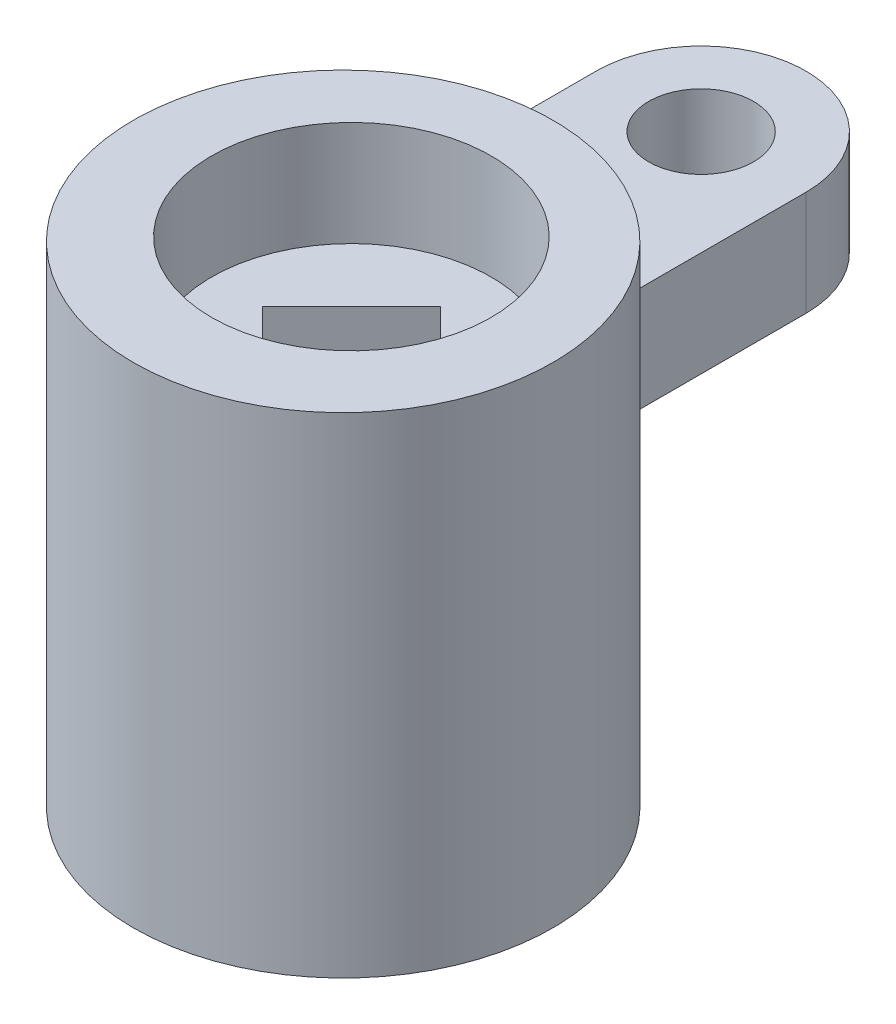
ISO-10303-21;
HEADER;
FILE_DESCRIPTION(('STEP AP214'),'2;1');
FILE_NAME('part.step','',(''),(''),'','','');
FILE_SCHEMA(('AUTOMOTIVE_DESIGN { 1 0 10303 214 1 1 1 1 }'));
ENDSEC;
DATA;
#1=APPLICATION_CONTEXT('core data for automotive mechanical design processes');
#2=APPLICATION_PROTOCOL_DEFINITION('international standard','automotive_design',2000,#1);
#3=PRODUCT_CONTEXT('',#1,'mechanical');
#4=PRODUCT('Part','Part','',(#3));
#5=PRODUCT_RELATED_PRODUCT_CATEGORY('part','',(#4));
#6=PRODUCT_DEFINITION_FORMATION('','',#4);
#7=PRODUCT_DEFINITION_CONTEXT('part definition',#1,'design');
#8=PRODUCT_DEFINITION('design','',#6,#7);
#9=PRODUCT_DEFINITION_SHAPE('','',#8);
#10=(LENGTH_UNIT() NAMED_UNIT(*) SI_UNIT(.MILLI.,.METRE.));
#11=(NAMED_UNIT(*) PLANE_ANGLE_UNIT() SI_UNIT($,.RADIAN.));
#12=(NAMED_UNIT(*) SI_UNIT($,.STERADIAN.) SOLID_ANGLE_UNIT());
#13=UNCERTAINTY_MEASURE_WITH_UNIT(LENGTH_MEASURE(1.E-05),#10,'distance_accuracy_value','');
#14=(GEOMETRIC_REPRESENTATION_CONTEXT(3) GLOBAL_UNCERTAINTY_ASSIGNED_CONTEXT((#13)) GLOBAL_UNIT_ASSIGNED_CONTEXT((#10,
#11,#12)) REPRESENTATION_CONTEXT('',''));
#15=CARTESIAN_POINT('',(0.,0.,0.));
#16=DIRECTION('',(0.,0.,1.));
#17=DIRECTION('',(1.,0.,0.));
#18=AXIS2_PLACEMENT_3D('',#15,#16,#17);
#19=CARTESIAN_POINT('',(0.,0.,1.17345771558665));
#20=DIRECTION('',(0.,1.,0.));
#21=DIRECTION('',(0.,0.,1.));
#22=AXIS2_PLACEMENT_3D('',#19,#20,#21);
#23=PLANE('',#22);
#24=CARTESIAN_POINT('',(0.,0.,1.17345771558665));
#25=DIRECTION('',(0.,1.,0.));
#26=DIRECTION('',(0.,0.,1.));
#27=AXIS2_PLACEMENT_3D('',#24,#25,#26);
#28=CIRCLE('',#27,30.);
#29=CARTESIAN_POINT('',(0.,0.,31.1734577155866));
#30=VERTEX_POINT('',#29);
#31=EDGE_CURVE('E45',#30,#30,#28,.T.);
#32=ORIENTED_EDGE('',*,*,#31,.F.);
#33=EDGE_LOOP('',(#32));
#34=FACE_BOUND('',#33,.T.);
#35=DIRECTION('',(0.707106781186553,0.,0.707106781186542));
#36=VECTOR('',#35,1.);
#37=CARTESIAN_POINT('',(-12.7279220613579,0.,0.));
#38=LINE('',#37,#36);
#39=CARTESIAN_POINT('',(-12.7279220613579,0.,0.));
#40=VERTEX_POINT('',#39);
#41=CARTESIAN_POINT('',(0.,0.,12.7279220613578));
#42=VERTEX_POINT('',#41);
#43=EDGE_CURVE('E140',#40,#42,#38,.T.);
#44=ORIENTED_EDGE('',*,*,#43,.T.);
#45=DIRECTION('',(0.707106781186551,0.,-0.707106781186544));
#46=VECTOR('',#45,1.);
#47=CARTESIAN_POINT('',(0.,0.,12.7279220613578));
#48=LINE('',#47,#46);
#49=CARTESIAN_POINT('',(12.7279220613579,0.,0.));
#50=VERTEX_POINT('',#49);
#51=EDGE_CURVE('E157',#42,#50,#48,.T.);
#52=ORIENTED_EDGE('',*,*,#51,.T.);
#53=DIRECTION('',(-0.707106781186544,0.,-0.707106781186551));
#54=VECTOR('',#53,1.);
#55=CARTESIAN_POINT('',(12.7279220613579,0.,0.));
#56=LINE('',#55,#54);
#57=CARTESIAN_POINT('',(1.39747780576547E-13,0.,-12.7279220613579));
#58=VERTEX_POINT('',#57);
#59=EDGE_CURVE('E160',#50,#58,#56,.T.);
#60=ORIENTED_EDGE('',*,*,#59,.T.);
#61=DIRECTION('',(-0.707106781186549,0.,0.707106781186546));
#62=VECTOR('',#61,1.);
#63=CARTESIAN_POINT('',(1.39747780576547E-13,0.,-12.7279220613579));
#64=LINE('',#63,#62);
#65=EDGE_CURVE('E147',#58,#40,#64,.T.);
#66=ORIENTED_EDGE('',*,*,#65,.T.);
#67=EDGE_LOOP('',(#44,#52,#60,#66));
#68=FACE_BOUND('',#67,.T.);
#69=ADVANCED_FACE('F41',(#34,#68),#23,.F.);
#70=CARTESIAN_POINT('',(0.,70.,1.17345771558665));
#71=DIRECTION('',(0.,-1.,0.));
#72=DIRECTION('',(0.,0.,-1.));
#73=AXIS2_PLACEMENT_3D('',#70,#71,#72);
#74=CYLINDRICAL_SURFACE('',#73,30.);
#75=DIRECTION('',(0.,-1.,0.));
#76=VECTOR('',#75,1.);
#77=CARTESIAN_POINT('',(15.,58.,-24.8073043979465));
#78=LINE('',#77,#76);
#79=CARTESIAN_POINT('',(15.,58.,-24.8073043979465));
#80=VERTEX_POINT('',#79);
#81=CARTESIAN_POINT('',(15.,43.,-24.8073043979465));
#82=VERTEX_POINT('',#81);
#83=EDGE_CURVE('E56',#80,#82,#78,.T.);
#84=ORIENTED_EDGE('',*,*,#83,.F.);
#85=CARTESIAN_POINT('',(0.,58.,1.17345771558665));
#86=DIRECTION('',(0.,1.,0.));
#87=DIRECTION('',(0.,0.,1.));
#88=AXIS2_PLACEMENT_3D('',#85,#86,#87);
#89=CIRCLE('',#88,30.);
#90=CARTESIAN_POINT('',(-15.,58.,-24.8073043979465));
#91=VERTEX_POINT('',#90);
#92=EDGE_CURVE('E60',#80,#91,#89,.T.);
#93=ORIENTED_EDGE('',*,*,#92,.T.);
#94=DIRECTION('',(0.,-1.,0.));
#95=VECTOR('',#94,1.);
#96=CARTESIAN_POINT('',(-15.,58.,-24.8073043979465));
#97=LINE('',#96,#95);
#98=CARTESIAN_POINT('',(-15.,43.,-24.8073043979465));
#99=VERTEX_POINT('',#98);
#100=EDGE_CURVE('E123',#91,#99,#97,.T.);
#101=ORIENTED_EDGE('',*,*,#100,.T.);
#102=CARTESIAN_POINT('',(0.,43.,1.17345771558665));
#103=DIRECTION('',(0.,1.,0.));
#104=DIRECTION('',(0.,0.,1.));
#105=AXIS2_PLACEMENT_3D('',#102,#103,#104);
#106=CIRCLE('',#105,30.);
#107=EDGE_CURVE('E133',#82,#99,#106,.T.);
#108=ORIENTED_EDGE('',*,*,#107,.F.);
#109=EDGE_LOOP('',(#84,#93,#101,#108));
#110=FACE_BOUND('',#109,.T.);
#111=CARTESIAN_POINT('',(0.,70.,1.17345771558665));
#112=DIRECTION('',(0.,1.,0.));
#113=DIRECTION('',(0.,0.,1.));
#114=AXIS2_PLACEMENT_3D('',#111,#112,#113);
#115=CIRCLE('',#114,30.);
#116=CARTESIAN_POINT('',(0.,70.,31.1734577155866));
#117=VERTEX_POINT('',#116);
#118=EDGE_CURVE('E11',#117,#117,#115,.T.);
#119=ORIENTED_EDGE('',*,*,#118,.F.);
#120=EDGE_LOOP('',(#119));
#121=FACE_BOUND('',#120,.T.);
#122=ORIENTED_EDGE('',*,*,#31,.T.);
#123=EDGE_LOOP('',(#122));
#124=FACE_BOUND('',#123,.T.);
#125=ADVANCED_FACE('F43',(#110,#121,#124),#74,.T.);
#126=CARTESIAN_POINT('',(0.,70.,1.17345771558665));
#127=DIRECTION('',(0.,1.,0.));
#128=DIRECTION('',(0.,0.,1.));
#129=AXIS2_PLACEMENT_3D('',#126,#127,#128);
#130=PLANE('',#129);
#131=CARTESIAN_POINT('',(0.,70.,0.));
#132=DIRECTION('',(0.,1.,0.));
#133=DIRECTION('',(0.,0.,1.));
#134=AXIS2_PLACEMENT_3D('',#131,#132,#133);
#135=CIRCLE('',#134,20.);
#136=CARTESIAN_POINT('',(0.,70.,20.));
#137=VERTEX_POINT('',#136);
#138=EDGE_CURVE('E174',#137,#137,#135,.T.);
#139=ORIENTED_EDGE('',*,*,#138,.F.);
#140=EDGE_LOOP('',(#139));
#141=FACE_BOUND('',#140,.T.);
#142=ORIENTED_EDGE('',*,*,#118,.T.);
#143=EDGE_LOOP('',(#142));
#144=FACE_BOUND('',#143,.T.);
#145=ADVANCED_FACE('F183',(#141,#144),#130,.T.);
#146=CARTESIAN_POINT('',(0.,55.,0.));
#147=DIRECTION('',(0.,1.,0.));
#148=DIRECTION('',(0.,0.,1.));
#149=AXIS2_PLACEMENT_3D('',#146,#147,#148);
#150=CYLINDRICAL_SURFACE('',#149,20.);
#151=CARTESIAN_POINT('',(0.,55.,0.));
#152=DIRECTION('',(0.,1.,0.));
#153=DIRECTION('',(0.,0.,1.));
#154=AXIS2_PLACEMENT_3D('',#151,#152,#153);
#155=CIRCLE('',#154,20.);
#156=CARTESIAN_POINT('',(0.,55.,20.));
#157=VERTEX_POINT('',#156);
#158=EDGE_CURVE('E175',#157,#157,#155,.T.);
#159=ORIENTED_EDGE('',*,*,#158,.F.);
#160=EDGE_LOOP('',(#159));
#161=FACE_BOUND('',#160,.T.);
#162=ORIENTED_EDGE('',*,*,#138,.T.);
#163=EDGE_LOOP('',(#162));
#164=FACE_BOUND('',#163,.T.);
#165=ADVANCED_FACE('F181',(#161,#164),#150,.F.);
#166=CARTESIAN_POINT('',(0.,55.,0.));
#167=DIRECTION('',(0.,1.,0.));
#168=DIRECTION('',(0.,0.,1.));
#169=AXIS2_PLACEMENT_3D('',#166,#167,#168);
#170=PLANE('',#169);
#171=DIRECTION('',(0.707106781186553,0.,0.707106781186542));
#172=VECTOR('',#171,1.);
#173=CARTESIAN_POINT('',(-12.7279220613579,55.,0.));
#174=LINE('',#173,#172);
#175=CARTESIAN_POINT('',(-12.7279220613579,55.,0.));
#176=VERTEX_POINT('',#175);
#177=CARTESIAN_POINT('',(0.,55.,12.7279220613578));
#178=VERTEX_POINT('',#177);
#179=EDGE_CURVE('E144',#176,#178,#174,.T.);
#180=ORIENTED_EDGE('',*,*,#179,.F.);
#181=DIRECTION('',(-0.707106781186549,0.,0.707106781186546));
#182=VECTOR('',#181,1.);
#183=CARTESIAN_POINT('',(1.39747780576547E-13,55.,-12.7279220613579));
#184=LINE('',#183,#182);
#185=CARTESIAN_POINT('',(1.39747780576547E-13,55.,-12.7279220613579));
#186=VERTEX_POINT('',#185);
#187=EDGE_CURVE('E152',#186,#176,#184,.T.);
#188=ORIENTED_EDGE('',*,*,#187,.F.);
#189=DIRECTION('',(-0.707106781186544,0.,-0.707106781186551));
#190=VECTOR('',#189,1.);
#191=CARTESIAN_POINT('',(12.7279220613579,55.,0.));
#192=LINE('',#191,#190);
#193=CARTESIAN_POINT('',(12.7279220613579,55.,0.));
#194=VERTEX_POINT('',#193);
#195=EDGE_CURVE('E149',#194,#186,#192,.T.);
#196=ORIENTED_EDGE('',*,*,#195,.F.);
#197=DIRECTION('',(0.707106781186551,0.,-0.707106781186544));
#198=VECTOR('',#197,1.);
#199=CARTESIAN_POINT('',(0.,55.,12.7279220613578));
#200=LINE('',#199,#198);
#201=EDGE_CURVE('E146',#178,#194,#200,.T.);
#202=ORIENTED_EDGE('',*,*,#201,.F.);
#203=EDGE_LOOP('',(#180,#188,#196,#202));
#204=FACE_BOUND('',#203,.T.);
#205=ORIENTED_EDGE('',*,*,#158,.T.);
#206=EDGE_LOOP('',(#205));
#207=FACE_BOUND('',#206,.T.);
#208=ADVANCED_FACE('F207',(#204,#207),#170,.T.);
#209=CARTESIAN_POINT('',(-12.7279220613579,55.,0.));
#210=DIRECTION('',(0.707106781186542,0.,-0.707106781186554));
#211=DIRECTION('',(-0.707106781186554,0.,-0.707106781186542));
#212=AXIS2_PLACEMENT_3D('',#209,#210,#211);
#213=PLANE('',#212);
#214=ORIENTED_EDGE('',*,*,#43,.F.);
#215=DIRECTION('',(0.,-1.,0.));
#216=VECTOR('',#215,1.);
#217=CARTESIAN_POINT('',(-12.7279220613579,55.,0.));
#218=LINE('',#217,#216);
#219=EDGE_CURVE('E154',#176,#40,#218,.T.);
#220=ORIENTED_EDGE('',*,*,#219,.F.);
#221=ORIENTED_EDGE('',*,*,#179,.T.);
#222=DIRECTION('',(0.,-1.,0.));
#223=VECTOR('',#222,1.);
#224=CARTESIAN_POINT('',(0.,55.,12.7279220613578));
#225=LINE('',#224,#223);
#226=EDGE_CURVE('E171',#178,#42,#225,.T.);
#227=ORIENTED_EDGE('',*,*,#226,.T.);
#228=EDGE_LOOP('',(#214,#220,#221,#227));
#229=FACE_BOUND('',#228,.T.);
#230=ADVANCED_FACE('F199',(#229),#213,.T.);
#231=CARTESIAN_POINT('',(0.,55.,12.7279220613578));
#232=DIRECTION('',(-0.707106781186544,0.,-0.707106781186552));
#233=DIRECTION('',(-0.707106781186551,0.,0.707106781186544));
#234=AXIS2_PLACEMENT_3D('',#231,#232,#233);
#235=PLANE('',#234);
#236=ORIENTED_EDGE('',*,*,#51,.F.);
#237=ORIENTED_EDGE('',*,*,#226,.F.);
#238=ORIENTED_EDGE('',*,*,#201,.T.);
#239=DIRECTION('',(0.,-1.,0.));
#240=VECTOR('',#239,1.);
#241=CARTESIAN_POINT('',(12.7279220613579,55.,0.));
#242=LINE('',#241,#240);
#243=EDGE_CURVE('E169',#194,#50,#242,.T.);
#244=ORIENTED_EDGE('',*,*,#243,.T.);
#245=EDGE_LOOP('',(#236,#237,#238,#244));
#246=FACE_BOUND('',#245,.T.);
#247=ADVANCED_FACE('F211',(#246),#235,.T.);
#248=CARTESIAN_POINT('',(12.7279220613579,55.,0.));
#249=DIRECTION('',(-0.707106781186552,0.,0.707106781186544));
#250=DIRECTION('',(0.707106781186544,0.,0.707106781186551));
#251=AXIS2_PLACEMENT_3D('',#248,#249,#250);
#252=PLANE('',#251);
#253=ORIENTED_EDGE('',*,*,#59,.F.);
#254=ORIENTED_EDGE('',*,*,#243,.F.);
#255=ORIENTED_EDGE('',*,*,#195,.T.);
#256=DIRECTION('',(0.,-1.,0.));
#257=VECTOR('',#256,1.);
#258=CARTESIAN_POINT('',(1.39747780576547E-13,55.,-12.7279220613579));
#259=LINE('',#258,#257);
#260=EDGE_CURVE('E167',#186,#58,#259,.T.);
#261=ORIENTED_EDGE('',*,*,#260,.T.);
#262=EDGE_LOOP('',(#253,#254,#255,#261));
#263=FACE_BOUND('',#262,.T.);
#264=ADVANCED_FACE('F215',(#263),#252,.T.);
#265=CARTESIAN_POINT('',(1.39747780576547E-13,55.,-12.7279220613579));
#266=DIRECTION('',(0.707106781186546,0.,0.707106781186549));
#267=DIRECTION('',(0.707106781186549,0.,-0.707106781186546));
#268=AXIS2_PLACEMENT_3D('',#265,#266,#267);
#269=PLANE('',#268);
#270=ORIENTED_EDGE('',*,*,#65,.F.);
#271=ORIENTED_EDGE('',*,*,#260,.F.);
#272=ORIENTED_EDGE('',*,*,#187,.T.);
#273=ORIENTED_EDGE('',*,*,#219,.T.);
#274=EDGE_LOOP('',(#270,#271,#272,#273));
#275=FACE_BOUND('',#274,.T.);
#276=ADVANCED_FACE('F203',(#275),#269,.T.);
#277=CARTESIAN_POINT('',(15.,58.,-50.));
#278=DIRECTION('',(1.,0.,0.));
#279=DIRECTION('',(0.,0.,-1.));
#280=AXIS2_PLACEMENT_3D('',#277,#278,#279);
#281=PLANE('',#280);
#282=DIRECTION('',(0.,0.,1.));
#283=VECTOR('',#282,1.);
#284=CARTESIAN_POINT('',(15.,43.,-50.));
#285=LINE('',#284,#283);
#286=CARTESIAN_POINT('',(15.,43.,-50.));
#287=VERTEX_POINT('',#286);
#288=EDGE_CURVE('E130',#287,#82,#285,.T.);
#289=ORIENTED_EDGE('',*,*,#288,.F.);
#290=DIRECTION('',(0.,-1.,0.));
#291=VECTOR('',#290,1.);
#292=CARTESIAN_POINT('',(15.,58.,-50.));
#293=LINE('',#292,#291);
#294=CARTESIAN_POINT('',(15.,58.,-50.));
#295=VERTEX_POINT('',#294);
#296=EDGE_CURVE('E122',#295,#287,#293,.T.);
#297=ORIENTED_EDGE('',*,*,#296,.F.);
#298=DIRECTION('',(0.,0.,1.));
#299=VECTOR('',#298,1.);
#300=CARTESIAN_POINT('',(15.,58.,-50.));
#301=LINE('',#300,#299);
#302=EDGE_CURVE('E111',#295,#80,#301,.T.);
#303=ORIENTED_EDGE('',*,*,#302,.T.);
#304=ORIENTED_EDGE('',*,*,#83,.T.);
#305=EDGE_LOOP('',(#289,#297,#303,#304));
#306=FACE_BOUND('',#305,.T.);
#307=ADVANCED_FACE('F222',(#306),#281,.T.);
#308=CARTESIAN_POINT('',(0.,58.,-50.));
#309=DIRECTION('',(0.,-1.,0.));
#310=DIRECTION('',(0.,0.,-1.));
#311=AXIS2_PLACEMENT_3D('',#308,#309,#310);
#312=CYLINDRICAL_SURFACE('',#311,15.);
#313=CARTESIAN_POINT('',(0.,43.,-50.));
#314=DIRECTION('',(0.,1.,0.));
#315=DIRECTION('',(0.,0.,1.));
#316=AXIS2_PLACEMENT_3D('',#313,#314,#315);
#317=CIRCLE('',#316,15.);
#318=CARTESIAN_POINT('',(-15.,43.,-50.));
#319=VERTEX_POINT('',#318);
#320=EDGE_CURVE('E118',#287,#319,#317,.T.);
#321=ORIENTED_EDGE('',*,*,#320,.T.);
#322=DIRECTION('',(0.,-1.,0.));
#323=VECTOR('',#322,1.);
#324=CARTESIAN_POINT('',(-15.,58.,-50.));
#325=LINE('',#324,#323);
#326=CARTESIAN_POINT('',(-15.,58.,-50.));
#327=VERTEX_POINT('',#326);
#328=EDGE_CURVE('E115',#327,#319,#325,.T.);
#329=ORIENTED_EDGE('',*,*,#328,.F.);
#330=CARTESIAN_POINT('',(0.,58.,-50.));
#331=DIRECTION('',(0.,1.,0.));
#332=DIRECTION('',(0.,0.,1.));
#333=AXIS2_PLACEMENT_3D('',#330,#331,#332);
#334=CIRCLE('',#333,15.);
#335=EDGE_CURVE('E104',#295,#327,#334,.T.);
#336=ORIENTED_EDGE('',*,*,#335,.F.);
#337=ORIENTED_EDGE('',*,*,#296,.T.);
#338=EDGE_LOOP('',(#321,#329,#336,#337));
#339=FACE_BOUND('',#338,.T.);
#340=ADVANCED_FACE('F116',(#339),#312,.T.);
#341=CARTESIAN_POINT('',(-15.,58.,-50.));
#342=DIRECTION('',(1.,0.,0.));
#343=DIRECTION('',(0.,0.,-1.));
#344=AXIS2_PLACEMENT_3D('',#341,#342,#343);
#345=PLANE('',#344);
#346=DIRECTION('',(0.,0.,1.));
#347=VECTOR('',#346,1.);
#348=CARTESIAN_POINT('',(-15.,43.,-50.));
#349=LINE('',#348,#347);
#350=EDGE_CURVE('E137',#319,#99,#349,.T.);
#351=ORIENTED_EDGE('',*,*,#350,.T.);
#352=ORIENTED_EDGE('',*,*,#100,.F.);
#353=DIRECTION('',(0.,0.,1.));
#354=VECTOR('',#353,1.);
#355=CARTESIAN_POINT('',(-15.,58.,-50.));
#356=LINE('',#355,#354);
#357=EDGE_CURVE('E108',#327,#91,#356,.T.);
#358=ORIENTED_EDGE('',*,*,#357,.F.);
#359=ORIENTED_EDGE('',*,*,#328,.T.);
#360=EDGE_LOOP('',(#351,#352,#358,#359));
#361=FACE_BOUND('',#360,.T.);
#362=ADVANCED_FACE('F125',(#361),#345,.F.);
#363=CARTESIAN_POINT('',(0.,58.,1.17345771558665));
#364=DIRECTION('',(0.,1.,0.));
#365=DIRECTION('',(0.,0.,1.));
#366=AXIS2_PLACEMENT_3D('',#363,#364,#365);
#367=PLANE('',#366);
#368=CARTESIAN_POINT('',(0.,58.,-50.));
#369=DIRECTION('',(0.,1.,0.));
#370=DIRECTION('',(0.,0.,1.));
#371=AXIS2_PLACEMENT_3D('',#368,#369,#370);
#372=CIRCLE('',#371,7.5);
#373=CARTESIAN_POINT('',(0.,58.,-42.5));
#374=VERTEX_POINT('',#373);
#375=EDGE_CURVE('E329',#374,#374,#372,.T.);
#376=ORIENTED_EDGE('',*,*,#375,.F.);
#377=EDGE_LOOP('',(#376));
#378=FACE_BOUND('',#377,.T.);
#379=ORIENTED_EDGE('',*,*,#302,.F.);
#380=ORIENTED_EDGE('',*,*,#335,.T.);
#381=ORIENTED_EDGE('',*,*,#357,.T.);
#382=ORIENTED_EDGE('',*,*,#92,.F.);
#383=EDGE_LOOP('',(#379,#380,#381,#382));
#384=FACE_BOUND('',#383,.T.);
#385=ADVANCED_FACE('F106',(#378,#384),#367,.T.);
#386=CARTESIAN_POINT('',(0.,43.,1.17345771558665));
#387=DIRECTION('',(0.,1.,0.));
#388=DIRECTION('',(0.,0.,1.));
#389=AXIS2_PLACEMENT_3D('',#386,#387,#388);
#390=PLANE('',#389);
#391=CARTESIAN_POINT('',(0.,43.,-50.));
#392=DIRECTION('',(0.,1.,0.));
#393=DIRECTION('',(0.,0.,1.));
#394=AXIS2_PLACEMENT_3D('',#391,#392,#393);
#395=CIRCLE('',#394,7.5);
#396=CARTESIAN_POINT('',(0.,43.,-42.5));
#397=VERTEX_POINT('',#396);
#398=EDGE_CURVE('E134',#397,#397,#395,.T.);
#399=ORIENTED_EDGE('',*,*,#398,.T.);
#400=EDGE_LOOP('',(#399));
#401=FACE_BOUND('',#400,.T.);
#402=ORIENTED_EDGE('',*,*,#288,.T.);
#403=ORIENTED_EDGE('',*,*,#107,.T.);
#404=ORIENTED_EDGE('',*,*,#350,.F.);
#405=ORIENTED_EDGE('',*,*,#320,.F.);
#406=EDGE_LOOP('',(#402,#403,#404,#405));
#407=FACE_BOUND('',#406,.T.);
#408=ADVANCED_FACE('F301',(#401,#407),#390,.F.);
#409=CARTESIAN_POINT('',(0.,43.,-50.));
#410=DIRECTION('',(0.,1.,0.));
#411=DIRECTION('',(0.,0.,1.));
#412=AXIS2_PLACEMENT_3D('',#409,#410,#411);
#413=CYLINDRICAL_SURFACE('',#412,7.5);
#414=ORIENTED_EDGE('',*,*,#398,.F.);
#415=EDGE_LOOP('',(#414));
#416=FACE_BOUND('',#415,.T.);
#417=ORIENTED_EDGE('',*,*,#375,.T.);
#418=EDGE_LOOP('',(#417));
#419=FACE_BOUND('',#418,.T.);
#420=ADVANCED_FACE('F311',(#416,#419),#413,.F.);
#421=CLOSED_SHELL('',(#69,#125,#145,#165,#208,#230,#247,#264,#276,#307,#340,#362,#385,#408,#420));
#422=MANIFOLD_SOLID_BREP('B2',#421);
#423=ADVANCED_BREP_SHAPE_REPRESENTATION('',(#18,#422),#14);
#424=SHAPE_DEFINITION_REPRESENTATION(#9,#423);
ENDSEC;
END-ISO-10303-21;
